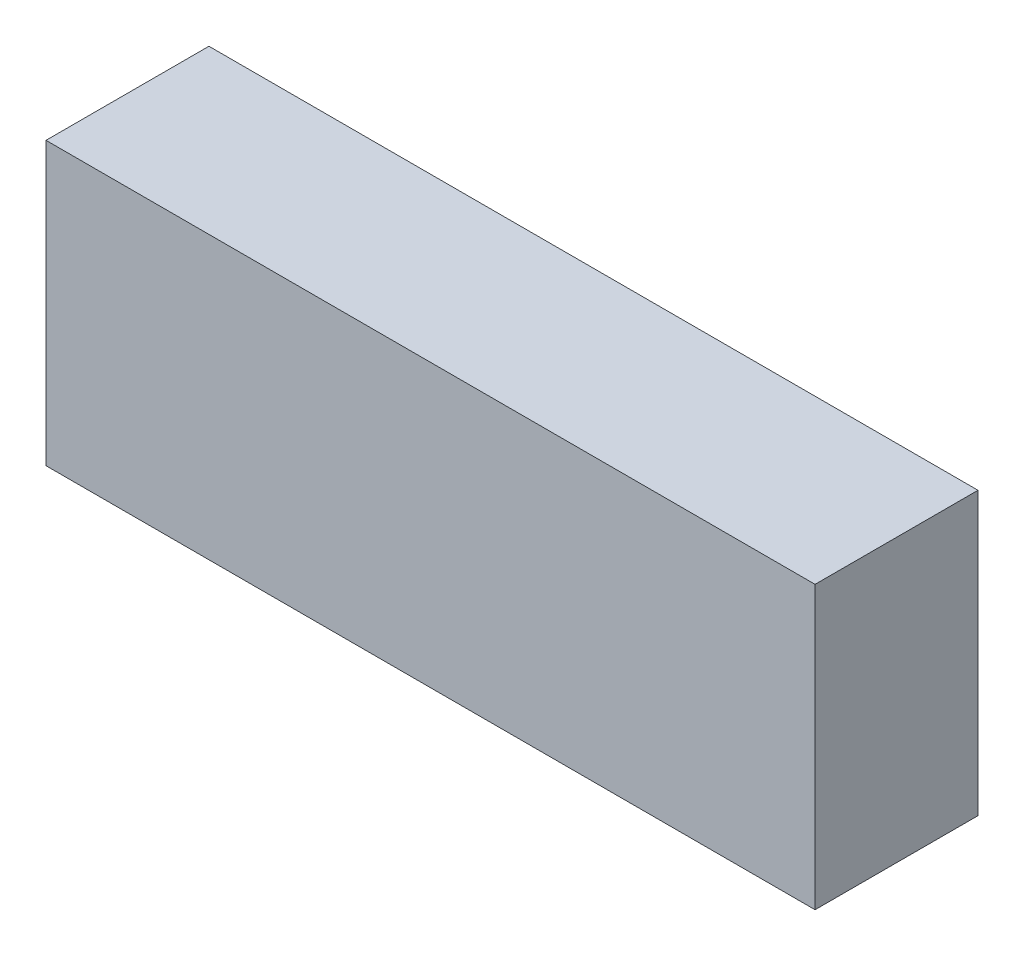
ISO-10303-21;
HEADER;
FILE_DESCRIPTION(('STEP AP214'),'2;1');
FILE_NAME('part.step','',(''),(''),'','','');
FILE_SCHEMA(('AUTOMOTIVE_DESIGN { 1 0 10303 214 1 1 1 1 }'));
ENDSEC;
DATA;
#1=APPLICATION_CONTEXT('core data for automotive mechanical design processes');
#2=APPLICATION_PROTOCOL_DEFINITION('international standard','automotive_design',2000,#1);
#3=PRODUCT_CONTEXT('',#1,'mechanical');
#4=PRODUCT('Part','Part','',(#3));
#5=PRODUCT_RELATED_PRODUCT_CATEGORY('part','',(#4));
#6=PRODUCT_DEFINITION_FORMATION('','',#4);
#7=PRODUCT_DEFINITION_CONTEXT('part definition',#1,'design');
#8=PRODUCT_DEFINITION('design','',#6,#7);
#9=PRODUCT_DEFINITION_SHAPE('','',#8);
#10=(LENGTH_UNIT() NAMED_UNIT(*) SI_UNIT(.MILLI.,.METRE.));
#11=(NAMED_UNIT(*) PLANE_ANGLE_UNIT() SI_UNIT($,.RADIAN.));
#12=(NAMED_UNIT(*) SI_UNIT($,.STERADIAN.) SOLID_ANGLE_UNIT());
#13=UNCERTAINTY_MEASURE_WITH_UNIT(LENGTH_MEASURE(1.E-05),#10,'distance_accuracy_value','');
#14=(GEOMETRIC_REPRESENTATION_CONTEXT(3) GLOBAL_UNCERTAINTY_ASSIGNED_CONTEXT((#13)) GLOBAL_UNIT_ASSIGNED_CONTEXT((#10,
#11,#12)) REPRESENTATION_CONTEXT('',''));
#15=CARTESIAN_POINT('',(0.,0.,0.));
#16=DIRECTION('',(0.,0.,1.));
#17=DIRECTION('',(1.,0.,0.));
#18=AXIS2_PLACEMENT_3D('',#15,#16,#17);
#19=CARTESIAN_POINT('',(-79.0368014902547,-17.63,7.25));
#20=DIRECTION('',(1.,0.,0.));
#21=DIRECTION('',(0.,0.,-1.));
#22=AXIS2_PLACEMENT_3D('',#19,#20,#21);
#23=PLANE('',#22);
#24=DIRECTION('',(0.,-1.,0.));
#25=VECTOR('',#24,1.);
#26=CARTESIAN_POINT('',(-79.0368014902547,-17.63,0.));
#27=LINE('',#26,#25);
#28=CARTESIAN_POINT('',(-79.0368014902547,-17.63,0.));
#29=VERTEX_POINT('',#28);
#30=CARTESIAN_POINT('',(-79.0368014902547,-30.17,0.));
#31=VERTEX_POINT('',#30);
#32=EDGE_CURVE('E128',#29,#31,#27,.T.);
#33=ORIENTED_EDGE('',*,*,#32,.T.);
#34=DIRECTION('',(0.,0.,-1.));
#35=VECTOR('',#34,1.);
#36=CARTESIAN_POINT('',(-79.0368014902547,-30.17,7.25));
#37=LINE('',#36,#35);
#38=CARTESIAN_POINT('',(-79.0368014902547,-30.17,7.25));
#39=VERTEX_POINT('',#38);
#40=EDGE_CURVE('E11',#39,#31,#37,.T.);
#41=ORIENTED_EDGE('',*,*,#40,.F.);
#42=DIRECTION('',(0.,-1.,0.));
#43=VECTOR('',#42,1.);
#44=CARTESIAN_POINT('',(-79.0368014902547,-17.63,7.25));
#45=LINE('',#44,#43);
#46=CARTESIAN_POINT('',(-79.0368014902547,-17.63,7.25));
#47=VERTEX_POINT('',#46);
#48=EDGE_CURVE('E148',#47,#39,#45,.T.);
#49=ORIENTED_EDGE('',*,*,#48,.F.);
#50=DIRECTION('',(0.,0.,-1.));
#51=VECTOR('',#50,1.);
#52=CARTESIAN_POINT('',(-79.0368014902547,-17.63,7.25));
#53=LINE('',#52,#51);
#54=EDGE_CURVE('E153',#47,#29,#53,.T.);
#55=ORIENTED_EDGE('',*,*,#54,.T.);
#56=EDGE_LOOP('',(#33,#41,#49,#55));
#57=FACE_BOUND('',#56,.T.);
#58=ADVANCED_FACE('F32',(#57),#23,.F.);
#59=CARTESIAN_POINT('',(-79.0368014902547,-30.17,7.25));
#60=DIRECTION('',(0.,1.,0.));
#61=DIRECTION('',(0.,0.,1.));
#62=AXIS2_PLACEMENT_3D('',#59,#60,#61);
#63=PLANE('',#62);
#64=DIRECTION('',(1.,0.,0.));
#65=VECTOR('',#64,1.);
#66=CARTESIAN_POINT('',(-79.0368014902547,-30.17,0.));
#67=LINE('',#66,#65);
#68=CARTESIAN_POINT('',(-44.8154999999996,-30.17,0.));
#69=VERTEX_POINT('',#68);
#70=EDGE_CURVE('E132',#31,#69,#67,.T.);
#71=ORIENTED_EDGE('',*,*,#70,.T.);
#72=DIRECTION('',(0.,0.,-1.));
#73=VECTOR('',#72,1.);
#74=CARTESIAN_POINT('',(-44.8154999999996,-30.17,7.25));
#75=LINE('',#74,#73);
#76=CARTESIAN_POINT('',(-44.8154999999996,-30.17,7.25));
#77=VERTEX_POINT('',#76);
#78=EDGE_CURVE('E39',#77,#69,#75,.T.);
#79=ORIENTED_EDGE('',*,*,#78,.F.);
#80=DIRECTION('',(1.,0.,0.));
#81=VECTOR('',#80,1.);
#82=CARTESIAN_POINT('',(-79.0368014902547,-30.17,7.25));
#83=LINE('',#82,#81);
#84=EDGE_CURVE('E83',#39,#77,#83,.T.);
#85=ORIENTED_EDGE('',*,*,#84,.F.);
#86=ORIENTED_EDGE('',*,*,#40,.T.);
#87=EDGE_LOOP('',(#71,#79,#85,#86));
#88=FACE_BOUND('',#87,.T.);
#89=ADVANCED_FACE('F182',(#88),#63,.F.);
#90=CARTESIAN_POINT('',(-44.8154999999996,-17.63,7.25));
#91=DIRECTION('',(-1.,0.,0.));
#92=DIRECTION('',(0.,0.,1.));
#93=AXIS2_PLACEMENT_3D('',#90,#91,#92);
#94=PLANE('',#93);
#95=DIRECTION('',(0.,1.,0.));
#96=VECTOR('',#95,1.);
#97=CARTESIAN_POINT('',(-44.8154999999996,-17.63,0.));
#98=LINE('',#97,#96);
#99=CARTESIAN_POINT('',(-44.8154999999996,-17.63,0.));
#100=VERTEX_POINT('',#99);
#101=EDGE_CURVE('E156',#69,#100,#98,.T.);
#102=ORIENTED_EDGE('',*,*,#101,.T.);
#103=DIRECTION('',(0.,0.,-1.));
#104=VECTOR('',#103,1.);
#105=CARTESIAN_POINT('',(-44.8154999999996,-17.63,7.25));
#106=LINE('',#105,#104);
#107=CARTESIAN_POINT('',(-44.8154999999996,-17.63,7.25));
#108=VERTEX_POINT('',#107);
#109=EDGE_CURVE('E160',#108,#100,#106,.T.);
#110=ORIENTED_EDGE('',*,*,#109,.F.);
#111=DIRECTION('',(0.,1.,0.));
#112=VECTOR('',#111,1.);
#113=CARTESIAN_POINT('',(-44.8154999999996,-17.63,7.25));
#114=LINE('',#113,#112);
#115=EDGE_CURVE('E151',#77,#108,#114,.T.);
#116=ORIENTED_EDGE('',*,*,#115,.F.);
#117=ORIENTED_EDGE('',*,*,#78,.T.);
#118=EDGE_LOOP('',(#102,#110,#116,#117));
#119=FACE_BOUND('',#118,.T.);
#120=ADVANCED_FACE('F165',(#119),#94,.F.);
#121=CARTESIAN_POINT('',(-79.0368014902547,-17.63,7.25));
#122=DIRECTION('',(0.,-1.,0.));
#123=DIRECTION('',(0.,0.,-1.));
#124=AXIS2_PLACEMENT_3D('',#121,#122,#123);
#125=PLANE('',#124);
#126=DIRECTION('',(-1.,0.,0.));
#127=VECTOR('',#126,1.);
#128=CARTESIAN_POINT('',(-79.0368014902547,-17.63,0.));
#129=LINE('',#128,#127);
#130=EDGE_CURVE('E76',#100,#29,#129,.T.);
#131=ORIENTED_EDGE('',*,*,#130,.T.);
#132=ORIENTED_EDGE('',*,*,#54,.F.);
#133=DIRECTION('',(-1.,0.,0.));
#134=VECTOR('',#133,1.);
#135=CARTESIAN_POINT('',(-79.0368014902547,-17.63,7.25));
#136=LINE('',#135,#134);
#137=EDGE_CURVE('E55',#108,#47,#136,.T.);
#138=ORIENTED_EDGE('',*,*,#137,.F.);
#139=ORIENTED_EDGE('',*,*,#109,.T.);
#140=EDGE_LOOP('',(#131,#132,#138,#139));
#141=FACE_BOUND('',#140,.T.);
#142=ADVANCED_FACE('F173',(#141),#125,.F.);
#143=CARTESIAN_POINT('',(0.,0.,7.25));
#144=DIRECTION('',(0.,0.,1.));
#145=DIRECTION('',(1.,0.,0.));
#146=AXIS2_PLACEMENT_3D('',#143,#144,#145);
#147=PLANE('',#146);
#148=ORIENTED_EDGE('',*,*,#48,.T.);
#149=ORIENTED_EDGE('',*,*,#84,.T.);
#150=ORIENTED_EDGE('',*,*,#115,.T.);
#151=ORIENTED_EDGE('',*,*,#137,.T.);
#152=EDGE_LOOP('',(#148,#149,#150,#151));
#153=FACE_BOUND('',#152,.T.);
#154=ADVANCED_FACE('F175',(#153),#147,.T.);
#155=CARTESIAN_POINT('',(0.,0.,0.));
#156=DIRECTION('',(0.,0.,1.));
#157=DIRECTION('',(1.,0.,0.));
#158=AXIS2_PLACEMENT_3D('',#155,#156,#157);
#159=PLANE('',#158);
#160=DIRECTION('',(-1.,0.,0.));
#161=VECTOR('',#160,1.);
#162=CARTESIAN_POINT('',(-79.0368014902547,-18.13,0.));
#163=LINE('',#162,#161);
#164=CARTESIAN_POINT('',(-45.3154999999996,-18.13,0.));
#165=VERTEX_POINT('',#164);
#166=CARTESIAN_POINT('',(-78.5368014902547,-18.13,0.));
#167=VERTEX_POINT('',#166);
#168=EDGE_CURVE('E123',#165,#167,#163,.T.);
#169=ORIENTED_EDGE('',*,*,#168,.T.);
#170=DIRECTION('',(0.,-1.,0.));
#171=VECTOR('',#170,1.);
#172=CARTESIAN_POINT('',(-78.5368014902547,-17.63,0.));
#173=LINE('',#172,#171);
#174=CARTESIAN_POINT('',(-78.5368014902547,-29.67,0.));
#175=VERTEX_POINT('',#174);
#176=EDGE_CURVE('E142',#167,#175,#173,.T.);
#177=ORIENTED_EDGE('',*,*,#176,.T.);
#178=DIRECTION('',(1.,0.,0.));
#179=VECTOR('',#178,1.);
#180=CARTESIAN_POINT('',(-79.0368014902547,-29.67,0.));
#181=LINE('',#180,#179);
#182=CARTESIAN_POINT('',(-45.3154999999996,-29.67,0.));
#183=VERTEX_POINT('',#182);
#184=EDGE_CURVE('E127',#175,#183,#181,.T.);
#185=ORIENTED_EDGE('',*,*,#184,.T.);
#186=DIRECTION('',(0.,1.,0.));
#187=VECTOR('',#186,1.);
#188=CARTESIAN_POINT('',(-45.3154999999996,-17.63,0.));
#189=LINE('',#188,#187);
#190=EDGE_CURVE('E46',#183,#165,#189,.T.);
#191=ORIENTED_EDGE('',*,*,#190,.T.);
#192=EDGE_LOOP('',(#169,#177,#185,#191));
#193=FACE_BOUND('',#192,.T.);
#194=ORIENTED_EDGE('',*,*,#32,.F.);
#195=ORIENTED_EDGE('',*,*,#130,.F.);
#196=ORIENTED_EDGE('',*,*,#101,.F.);
#197=ORIENTED_EDGE('',*,*,#70,.F.);
#198=EDGE_LOOP('',(#194,#195,#196,#197));
#199=FACE_BOUND('',#198,.T.);
#200=ADVANCED_FACE('F169',(#193,#199),#159,.F.);
#201=CARTESIAN_POINT('',(-78.5368014902547,-17.63,7.25));
#202=DIRECTION('',(1.,0.,0.));
#203=DIRECTION('',(0.,0.,-1.));
#204=AXIS2_PLACEMENT_3D('',#201,#202,#203);
#205=PLANE('',#204);
#206=ORIENTED_EDGE('',*,*,#176,.F.);
#207=DIRECTION('',(0.,0.,-1.));
#208=VECTOR('',#207,1.);
#209=CARTESIAN_POINT('',(-78.5368014902547,-18.13,7.25));
#210=LINE('',#209,#208);
#211=CARTESIAN_POINT('',(-78.5368014902547,-18.13,7.05));
#212=VERTEX_POINT('',#211);
#213=EDGE_CURVE('E122',#212,#167,#210,.T.);
#214=ORIENTED_EDGE('',*,*,#213,.F.);
#215=DIRECTION('',(0.,-1.,0.));
#216=VECTOR('',#215,1.);
#217=CARTESIAN_POINT('',(-78.5368014902547,-17.63,7.05));
#218=LINE('',#217,#216);
#219=CARTESIAN_POINT('',(-78.5368014902547,-29.67,7.05));
#220=VERTEX_POINT('',#219);
#221=EDGE_CURVE('E110',#212,#220,#218,.T.);
#222=ORIENTED_EDGE('',*,*,#221,.T.);
#223=DIRECTION('',(0.,0.,-1.));
#224=VECTOR('',#223,1.);
#225=CARTESIAN_POINT('',(-78.5368014902547,-29.67,7.25));
#226=LINE('',#225,#224);
#227=EDGE_CURVE('E120',#220,#175,#226,.T.);
#228=ORIENTED_EDGE('',*,*,#227,.T.);
#229=EDGE_LOOP('',(#206,#214,#222,#228));
#230=FACE_BOUND('',#229,.T.);
#231=ADVANCED_FACE('F119',(#230),#205,.T.);
#232=CARTESIAN_POINT('',(-79.0368014902547,-29.67,7.25));
#233=DIRECTION('',(0.,1.,0.));
#234=DIRECTION('',(0.,0.,1.));
#235=AXIS2_PLACEMENT_3D('',#232,#233,#234);
#236=PLANE('',#235);
#237=ORIENTED_EDGE('',*,*,#184,.F.);
#238=ORIENTED_EDGE('',*,*,#227,.F.);
#239=DIRECTION('',(1.,0.,0.));
#240=VECTOR('',#239,1.);
#241=CARTESIAN_POINT('',(-79.0368014902547,-29.67,7.05));
#242=LINE('',#241,#240);
#243=CARTESIAN_POINT('',(-45.3154999999996,-29.67,7.05));
#244=VERTEX_POINT('',#243);
#245=EDGE_CURVE('E106',#220,#244,#242,.T.);
#246=ORIENTED_EDGE('',*,*,#245,.T.);
#247=DIRECTION('',(0.,0.,-1.));
#248=VECTOR('',#247,1.);
#249=CARTESIAN_POINT('',(-45.3154999999996,-29.67,7.25));
#250=LINE('',#249,#248);
#251=EDGE_CURVE('E129',#244,#183,#250,.T.);
#252=ORIENTED_EDGE('',*,*,#251,.T.);
#253=EDGE_LOOP('',(#237,#238,#246,#252));
#254=FACE_BOUND('',#253,.T.);
#255=ADVANCED_FACE('F125',(#254),#236,.T.);
#256=CARTESIAN_POINT('',(-45.3154999999996,-17.63,7.25));
#257=DIRECTION('',(-1.,0.,0.));
#258=DIRECTION('',(0.,0.,1.));
#259=AXIS2_PLACEMENT_3D('',#256,#257,#258);
#260=PLANE('',#259);
#261=ORIENTED_EDGE('',*,*,#190,.F.);
#262=ORIENTED_EDGE('',*,*,#251,.F.);
#263=DIRECTION('',(0.,1.,0.));
#264=VECTOR('',#263,1.);
#265=CARTESIAN_POINT('',(-45.3154999999996,-17.63,7.05));
#266=LINE('',#265,#264);
#267=CARTESIAN_POINT('',(-45.3154999999996,-18.13,7.05));
#268=VERTEX_POINT('',#267);
#269=EDGE_CURVE('E111',#244,#268,#266,.T.);
#270=ORIENTED_EDGE('',*,*,#269,.T.);
#271=DIRECTION('',(0.,0.,-1.));
#272=VECTOR('',#271,1.);
#273=CARTESIAN_POINT('',(-45.3154999999996,-18.13,7.25));
#274=LINE('',#273,#272);
#275=EDGE_CURVE('E134',#268,#165,#274,.T.);
#276=ORIENTED_EDGE('',*,*,#275,.T.);
#277=EDGE_LOOP('',(#261,#262,#270,#276));
#278=FACE_BOUND('',#277,.T.);
#279=ADVANCED_FACE('F230',(#278),#260,.T.);
#280=CARTESIAN_POINT('',(-79.0368014902547,-18.13,7.25));
#281=DIRECTION('',(0.,-1.,0.));
#282=DIRECTION('',(0.,0.,-1.));
#283=AXIS2_PLACEMENT_3D('',#280,#281,#282);
#284=PLANE('',#283);
#285=ORIENTED_EDGE('',*,*,#168,.F.);
#286=ORIENTED_EDGE('',*,*,#275,.F.);
#287=DIRECTION('',(-1.,0.,0.));
#288=VECTOR('',#287,1.);
#289=CARTESIAN_POINT('',(-79.0368014902547,-18.13,7.05));
#290=LINE('',#289,#288);
#291=EDGE_CURVE('E137',#268,#212,#290,.T.);
#292=ORIENTED_EDGE('',*,*,#291,.T.);
#293=ORIENTED_EDGE('',*,*,#213,.T.);
#294=EDGE_LOOP('',(#285,#286,#292,#293));
#295=FACE_BOUND('',#294,.T.);
#296=ADVANCED_FACE('F239',(#295),#284,.T.);
#297=CARTESIAN_POINT('',(0.,0.,7.05));
#298=DIRECTION('',(0.,0.,1.));
#299=DIRECTION('',(1.,0.,0.));
#300=AXIS2_PLACEMENT_3D('',#297,#298,#299);
#301=PLANE('',#300);
#302=ORIENTED_EDGE('',*,*,#221,.F.);
#303=ORIENTED_EDGE('',*,*,#291,.F.);
#304=ORIENTED_EDGE('',*,*,#269,.F.);
#305=ORIENTED_EDGE('',*,*,#245,.F.);
#306=EDGE_LOOP('',(#302,#303,#304,#305));
#307=FACE_BOUND('',#306,.T.);
#308=ADVANCED_FACE('F108',(#307),#301,.F.);
#309=CLOSED_SHELL('',(#58,#89,#120,#142,#154,#200,#231,#255,#279,#296,#308));
#310=MANIFOLD_SOLID_BREP('B2',#309);
#311=ADVANCED_BREP_SHAPE_REPRESENTATION('',(#18,#310),#14);
#312=SHAPE_DEFINITION_REPRESENTATION(#9,#311);
ENDSEC;
END-ISO-10303-21;
